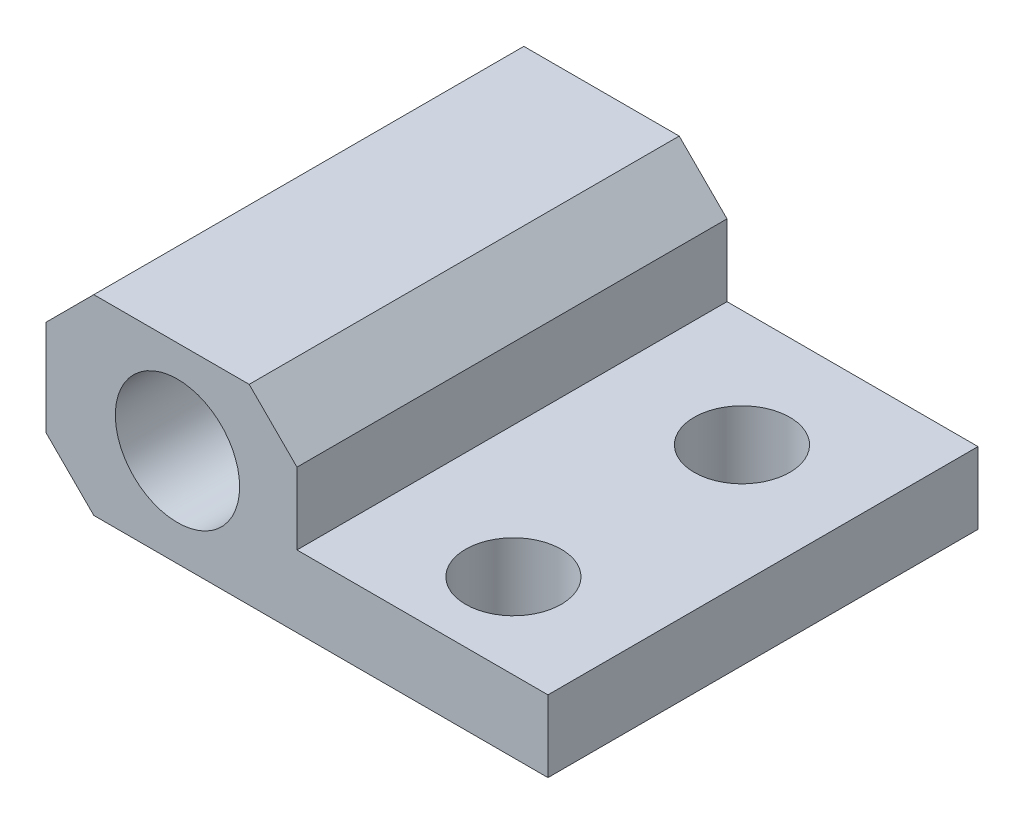
ISO-10303-21;
HEADER;
FILE_DESCRIPTION(('STEP AP214'),'2;1');
FILE_NAME('part.step','',(''),(''),'','','');
FILE_SCHEMA(('AUTOMOTIVE_DESIGN { 1 0 10303 214 1 1 1 1 }'));
ENDSEC;
DATA;
#1=APPLICATION_CONTEXT('core data for automotive mechanical design processes');
#2=APPLICATION_PROTOCOL_DEFINITION('international standard','automotive_design',2000,#1);
#3=PRODUCT_CONTEXT('',#1,'mechanical');
#4=PRODUCT('Part','Part','',(#3));
#5=PRODUCT_RELATED_PRODUCT_CATEGORY('part','',(#4));
#6=PRODUCT_DEFINITION_FORMATION('','',#4);
#7=PRODUCT_DEFINITION_CONTEXT('part definition',#1,'design');
#8=PRODUCT_DEFINITION('design','',#6,#7);
#9=PRODUCT_DEFINITION_SHAPE('','',#8);
#10=(LENGTH_UNIT() NAMED_UNIT(*) SI_UNIT(.MILLI.,.METRE.));
#11=(NAMED_UNIT(*) PLANE_ANGLE_UNIT() SI_UNIT($,.RADIAN.));
#12=(NAMED_UNIT(*) SI_UNIT($,.STERADIAN.) SOLID_ANGLE_UNIT());
#13=UNCERTAINTY_MEASURE_WITH_UNIT(LENGTH_MEASURE(1.E-05),#10,'distance_accuracy_value','');
#14=(GEOMETRIC_REPRESENTATION_CONTEXT(3) GLOBAL_UNCERTAINTY_ASSIGNED_CONTEXT((#13)) GLOBAL_UNIT_ASSIGNED_CONTEXT((#10,
#11,#12)) REPRESENTATION_CONTEXT('',''));
#15=CARTESIAN_POINT('',(0.,0.,0.));
#16=DIRECTION('',(0.,0.,1.));
#17=DIRECTION('',(1.,0.,0.));
#18=AXIS2_PLACEMENT_3D('',#15,#16,#17);
#19=CARTESIAN_POINT('',(-11.,8.,0.));
#20=DIRECTION('',(1.,0.,0.));
#21=DIRECTION('',(0.,0.,-1.));
#22=AXIS2_PLACEMENT_3D('',#19,#20,#21);
#23=PLANE('',#22);
#24=DIRECTION('',(0.,-1.,0.));
#25=VECTOR('',#24,1.);
#26=CARTESIAN_POINT('',(-11.,8.,0.));
#27=LINE('',#26,#25);
#28=CARTESIAN_POINT('',(-11.,5.99999999999999,0.));
#29=VERTEX_POINT('',#28);
#30=CARTESIAN_POINT('',(-11.,2.,0.));
#31=VERTEX_POINT('',#30);
#32=EDGE_CURVE('E142',#29,#31,#27,.T.);
#33=ORIENTED_EDGE('',*,*,#32,.T.);
#34=DIRECTION('',(0.,0.,1.));
#35=VECTOR('',#34,1.);
#36=CARTESIAN_POINT('',(-11.,2.,0.));
#37=LINE('',#36,#35);
#38=CARTESIAN_POINT('',(-11.,2.,17.9908558047486));
#39=VERTEX_POINT('',#38);
#40=EDGE_CURVE('E39',#31,#39,#37,.T.);
#41=ORIENTED_EDGE('',*,*,#40,.T.);
#42=DIRECTION('',(0.,-1.,0.));
#43=VECTOR('',#42,1.);
#44=CARTESIAN_POINT('',(-11.,8.,17.9908558047486));
#45=LINE('',#44,#43);
#46=CARTESIAN_POINT('',(-11.,5.99999999999999,17.9908558047486));
#47=VERTEX_POINT('',#46);
#48=EDGE_CURVE('E152',#47,#39,#45,.T.);
#49=ORIENTED_EDGE('',*,*,#48,.F.);
#50=DIRECTION('',(0.,0.,-1.));
#51=VECTOR('',#50,1.);
#52=CARTESIAN_POINT('',(-11.,5.99999999999999,0.));
#53=LINE('',#52,#51);
#54=EDGE_CURVE('E53',#47,#29,#53,.T.);
#55=ORIENTED_EDGE('',*,*,#54,.T.);
#56=EDGE_LOOP('',(#33,#41,#49,#55));
#57=FACE_BOUND('',#56,.T.);
#58=ADVANCED_FACE('F31',(#57),#23,.F.);
#59=CARTESIAN_POINT('',(-11.,8.,17.9908558047486));
#60=DIRECTION('',(0.,0.,-1.));
#61=DIRECTION('',(-1.,0.,0.));
#62=AXIS2_PLACEMENT_3D('',#59,#60,#61);
#63=PLANE('',#62);
#64=CARTESIAN_POINT('',(-5.50000003202421,4.09074319378488,17.9908558047486));
#65=DIRECTION('',(0.,0.,1.));
#66=DIRECTION('',(1.,0.,0.));
#67=AXIS2_PLACEMENT_3D('',#64,#65,#66);
#68=CIRCLE('',#67,2.6);
#69=CARTESIAN_POINT('',(-2.90000003202421,4.09074319378488,17.9908558047486));
#70=VERTEX_POINT('',#69);
#71=EDGE_CURVE('E243',#70,#70,#68,.T.);
#72=ORIENTED_EDGE('',*,*,#71,.F.);
#73=EDGE_LOOP('',(#72));
#74=FACE_BOUND('',#73,.T.);
#75=DIRECTION('',(0.,1.,0.));
#76=VECTOR('',#75,1.);
#77=CARTESIAN_POINT('',(-0.5,3.,17.9908558047486));
#78=LINE('',#77,#76);
#79=CARTESIAN_POINT('',(-0.5,3.,17.9908558047486));
#80=VERTEX_POINT('',#79);
#81=CARTESIAN_POINT('',(-0.499999999999999,6.,17.9908558047486));
#82=VERTEX_POINT('',#81);
#83=EDGE_CURVE('E117',#80,#82,#78,.T.);
#84=ORIENTED_EDGE('',*,*,#83,.T.);
#85=DIRECTION('',(-0.707106781186548,0.707106781186547,0.));
#86=VECTOR('',#85,1.);
#87=CARTESIAN_POINT('',(-0.5,6.,17.9908558047486));
#88=LINE('',#87,#86);
#89=CARTESIAN_POINT('',(-2.5,8.,17.9908558047486));
#90=VERTEX_POINT('',#89);
#91=EDGE_CURVE('E161',#82,#90,#88,.T.);
#92=ORIENTED_EDGE('',*,*,#91,.T.);
#93=DIRECTION('',(1.,0.,0.));
#94=VECTOR('',#93,1.);
#95=CARTESIAN_POINT('',(-11.,8.,17.9908558047486));
#96=LINE('',#95,#94);
#97=CARTESIAN_POINT('',(-8.99999999999999,8.,17.9908558047486));
#98=VERTEX_POINT('',#97);
#99=EDGE_CURVE('E135',#98,#90,#96,.T.);
#100=ORIENTED_EDGE('',*,*,#99,.F.);
#101=DIRECTION('',(-0.707106781186547,-0.707106781186548,0.));
#102=VECTOR('',#101,1.);
#103=CARTESIAN_POINT('',(-8.99999999999999,8.,17.9908558047486));
#104=LINE('',#103,#102);
#105=EDGE_CURVE('E157',#98,#47,#104,.T.);
#106=ORIENTED_EDGE('',*,*,#105,.T.);
#107=ORIENTED_EDGE('',*,*,#48,.T.);
#108=DIRECTION('',(-0.707106781186549,0.707106781186546,0.));
#109=VECTOR('',#108,1.);
#110=CARTESIAN_POINT('',(-11.,2.,17.9908558047486));
#111=LINE('',#110,#109);
#112=CARTESIAN_POINT('',(-8.99999999999999,0.,17.9908558047486));
#113=VERTEX_POINT('',#112);
#114=EDGE_CURVE('E159',#39,#113,#111,.F.);
#115=ORIENTED_EDGE('',*,*,#114,.T.);
#116=DIRECTION('',(1.,0.,0.));
#117=VECTOR('',#116,1.);
#118=CARTESIAN_POINT('',(-11.,0.,17.9908558047486));
#119=LINE('',#118,#117);
#120=CARTESIAN_POINT('',(10.,0.,17.9908558047486));
#121=VERTEX_POINT('',#120);
#122=EDGE_CURVE('E134',#113,#121,#119,.T.);
#123=ORIENTED_EDGE('',*,*,#122,.T.);
#124=DIRECTION('',(0.,-1.,0.));
#125=VECTOR('',#124,1.);
#126=CARTESIAN_POINT('',(10.,8.,17.9908558047486));
#127=LINE('',#126,#125);
#128=CARTESIAN_POINT('',(9.99999999481246,3.,17.9908558047486));
#129=VERTEX_POINT('',#128);
#130=EDGE_CURVE('E128',#129,#121,#127,.T.);
#131=ORIENTED_EDGE('',*,*,#130,.F.);
#132=DIRECTION('',(1.,0.,0.));
#133=VECTOR('',#132,1.);
#134=CARTESIAN_POINT('',(-0.5,3.,17.9908558047486));
#135=LINE('',#134,#133);
#136=EDGE_CURVE('E107',#80,#129,#135,.T.);
#137=ORIENTED_EDGE('',*,*,#136,.F.);
#138=EDGE_LOOP('',(#84,#92,#100,#106,#107,#115,#123,#131,#137));
#139=FACE_BOUND('',#138,.T.);
#140=ADVANCED_FACE('F126',(#74,#139),#63,.F.);
#141=CARTESIAN_POINT('',(10.,8.,0.));
#142=DIRECTION('',(-1.,0.,0.));
#143=DIRECTION('',(0.,0.,1.));
#144=AXIS2_PLACEMENT_3D('',#141,#142,#143);
#145=PLANE('',#144);
#146=DIRECTION('',(0.,-1.,0.));
#147=VECTOR('',#146,1.);
#148=CARTESIAN_POINT('',(10.,8.,0.));
#149=LINE('',#148,#147);
#150=CARTESIAN_POINT('',(9.99999999481246,3.,0.));
#151=VERTEX_POINT('',#150);
#152=CARTESIAN_POINT('',(10.,0.,0.));
#153=VERTEX_POINT('',#152);
#154=EDGE_CURVE('E149',#151,#153,#149,.T.);
#155=ORIENTED_EDGE('',*,*,#154,.F.);
#156=DIRECTION('',(0.,0.,-1.));
#157=VECTOR('',#156,1.);
#158=CARTESIAN_POINT('',(9.99999999481246,3.,17.9908558047486));
#159=LINE('',#158,#157);
#160=EDGE_CURVE('E123',#129,#151,#159,.T.);
#161=ORIENTED_EDGE('',*,*,#160,.F.);
#162=ORIENTED_EDGE('',*,*,#130,.T.);
#163=DIRECTION('',(0.,0.,-1.));
#164=VECTOR('',#163,1.);
#165=CARTESIAN_POINT('',(10.,0.,0.));
#166=LINE('',#165,#164);
#167=EDGE_CURVE('E144',#121,#153,#166,.T.);
#168=ORIENTED_EDGE('',*,*,#167,.T.);
#169=EDGE_LOOP('',(#155,#161,#162,#168));
#170=FACE_BOUND('',#169,.T.);
#171=ADVANCED_FACE('F205',(#170),#145,.F.);
#172=CARTESIAN_POINT('',(-11.,8.,0.));
#173=DIRECTION('',(0.,0.,1.));
#174=DIRECTION('',(1.,0.,0.));
#175=AXIS2_PLACEMENT_3D('',#172,#173,#174);
#176=PLANE('',#175);
#177=DIRECTION('',(-1.,0.,0.));
#178=VECTOR('',#177,1.);
#179=CARTESIAN_POINT('',(-11.,8.,0.));
#180=LINE('',#179,#178);
#181=CARTESIAN_POINT('',(-2.5,8.,0.));
#182=VERTEX_POINT('',#181);
#183=CARTESIAN_POINT('',(-8.99999999999999,8.,0.));
#184=VERTEX_POINT('',#183);
#185=EDGE_CURVE('E138',#182,#184,#180,.T.);
#186=ORIENTED_EDGE('',*,*,#185,.F.);
#187=DIRECTION('',(0.707106781186548,-0.707106781186547,0.));
#188=VECTOR('',#187,1.);
#189=CARTESIAN_POINT('',(-0.5,6.,0.));
#190=LINE('',#189,#188);
#191=CARTESIAN_POINT('',(-0.499999999999999,6.,0.));
#192=VERTEX_POINT('',#191);
#193=EDGE_CURVE('E171',#182,#192,#190,.T.);
#194=ORIENTED_EDGE('',*,*,#193,.T.);
#195=DIRECTION('',(0.,-1.,0.));
#196=VECTOR('',#195,1.);
#197=CARTESIAN_POINT('',(-0.499999999999999,8.,0.));
#198=LINE('',#197,#196);
#199=CARTESIAN_POINT('',(-0.5,3.,0.));
#200=VERTEX_POINT('',#199);
#201=EDGE_CURVE('E122',#192,#200,#198,.T.);
#202=ORIENTED_EDGE('',*,*,#201,.T.);
#203=DIRECTION('',(1.,0.,0.));
#204=VECTOR('',#203,1.);
#205=CARTESIAN_POINT('',(-11.,3.,0.));
#206=LINE('',#205,#204);
#207=EDGE_CURVE('E110',#200,#151,#206,.T.);
#208=ORIENTED_EDGE('',*,*,#207,.T.);
#209=ORIENTED_EDGE('',*,*,#154,.T.);
#210=DIRECTION('',(-1.,0.,0.));
#211=VECTOR('',#210,1.);
#212=CARTESIAN_POINT('',(-11.,0.,0.));
#213=LINE('',#212,#211);
#214=CARTESIAN_POINT('',(-8.99999999999999,0.,0.));
#215=VERTEX_POINT('',#214);
#216=EDGE_CURVE('E139',#153,#215,#213,.T.);
#217=ORIENTED_EDGE('',*,*,#216,.T.);
#218=DIRECTION('',(0.707106781186549,-0.707106781186546,0.));
#219=VECTOR('',#218,1.);
#220=CARTESIAN_POINT('',(-11.,2.,0.));
#221=LINE('',#220,#219);
#222=EDGE_CURVE('E46',#215,#31,#221,.F.);
#223=ORIENTED_EDGE('',*,*,#222,.T.);
#224=ORIENTED_EDGE('',*,*,#32,.F.);
#225=DIRECTION('',(0.707106781186547,0.707106781186548,0.));
#226=VECTOR('',#225,1.);
#227=CARTESIAN_POINT('',(-8.99999999999999,8.,0.));
#228=LINE('',#227,#226);
#229=EDGE_CURVE('E168',#29,#184,#228,.T.);
#230=ORIENTED_EDGE('',*,*,#229,.T.);
#231=EDGE_LOOP('',(#186,#194,#202,#208,#209,#217,#223,#224,#230));
#232=FACE_BOUND('',#231,.T.);
#233=ADVANCED_FACE('F186',(#232),#176,.F.);
#234=CARTESIAN_POINT('',(-11.,8.,17.9908558047486));
#235=DIRECTION('',(0.,1.,0.));
#236=DIRECTION('',(0.,0.,1.));
#237=AXIS2_PLACEMENT_3D('',#234,#235,#236);
#238=PLANE('',#237);
#239=ORIENTED_EDGE('',*,*,#99,.T.);
#240=DIRECTION('',(0.,0.,-1.));
#241=VECTOR('',#240,1.);
#242=CARTESIAN_POINT('',(-2.5,8.,0.));
#243=LINE('',#242,#241);
#244=EDGE_CURVE('E166',#90,#182,#243,.T.);
#245=ORIENTED_EDGE('',*,*,#244,.T.);
#246=ORIENTED_EDGE('',*,*,#185,.T.);
#247=DIRECTION('',(0.,0.,1.));
#248=VECTOR('',#247,1.);
#249=CARTESIAN_POINT('',(-8.99999999999999,8.,17.9908558047486));
#250=LINE('',#249,#248);
#251=EDGE_CURVE('E163',#184,#98,#250,.T.);
#252=ORIENTED_EDGE('',*,*,#251,.T.);
#253=EDGE_LOOP('',(#239,#245,#246,#252));
#254=FACE_BOUND('',#253,.T.);
#255=ADVANCED_FACE('F182',(#254),#238,.T.);
#256=CARTESIAN_POINT('',(-11.,0.,17.9908558047486));
#257=DIRECTION('',(0.,1.,0.));
#258=DIRECTION('',(0.,0.,1.));
#259=AXIS2_PLACEMENT_3D('',#256,#257,#258);
#260=PLANE('',#259);
#261=CARTESIAN_POINT('',(4.99999999481206,0.,4.87358379755558));
#262=DIRECTION('',(0.,1.,0.));
#263=DIRECTION('',(0.,0.,1.));
#264=AXIS2_PLACEMENT_3D('',#261,#262,#263);
#265=CIRCLE('',#264,1.99999994245589);
#266=CARTESIAN_POINT('',(4.99999999481206,0.,6.87358374001147));
#267=VERTEX_POINT('',#266);
#268=EDGE_CURVE('E248',#267,#267,#265,.T.);
#269=ORIENTED_EDGE('',*,*,#268,.T.);
#270=EDGE_LOOP('',(#269));
#271=FACE_BOUND('',#270,.T.);
#272=CARTESIAN_POINT('',(4.99999999481206,0.,14.4361185859939));
#273=DIRECTION('',(0.,1.,0.));
#274=DIRECTION('',(0.,0.,1.));
#275=AXIS2_PLACEMENT_3D('',#272,#273,#274);
#276=CIRCLE('',#275,1.99999988156109);
#277=CARTESIAN_POINT('',(4.99999999481206,0.,16.4361184675549));
#278=VERTEX_POINT('',#277);
#279=EDGE_CURVE('E113',#278,#278,#276,.T.);
#280=ORIENTED_EDGE('',*,*,#279,.T.);
#281=EDGE_LOOP('',(#280));
#282=FACE_BOUND('',#281,.T.);
#283=ORIENTED_EDGE('',*,*,#122,.F.);
#284=DIRECTION('',(0.,0.,-1.));
#285=VECTOR('',#284,1.);
#286=CARTESIAN_POINT('',(-8.99999999999999,0.,17.9908558047486));
#287=LINE('',#286,#285);
#288=EDGE_CURVE('E11',#113,#215,#287,.T.);
#289=ORIENTED_EDGE('',*,*,#288,.T.);
#290=ORIENTED_EDGE('',*,*,#216,.F.);
#291=ORIENTED_EDGE('',*,*,#167,.F.);
#292=EDGE_LOOP('',(#283,#289,#290,#291));
#293=FACE_BOUND('',#292,.T.);
#294=ADVANCED_FACE('F214',(#271,#282,#293),#260,.F.);
#295=CARTESIAN_POINT('',(-0.5,3.,-0.00351336228412991));
#296=DIRECTION('',(0.,-1.,0.));
#297=DIRECTION('',(0.,0.,-1.));
#298=AXIS2_PLACEMENT_3D('',#295,#296,#297);
#299=PLANE('',#298);
#300=CARTESIAN_POINT('',(4.99999999481206,3.,4.87358379755558));
#301=DIRECTION('',(0.,1.,0.));
#302=DIRECTION('',(0.,0.,1.));
#303=AXIS2_PLACEMENT_3D('',#300,#301,#302);
#304=CIRCLE('',#303,1.99999994245589);
#305=CARTESIAN_POINT('',(4.99999999481206,3.,6.87358374001147));
#306=VERTEX_POINT('',#305);
#307=EDGE_CURVE('E245',#306,#306,#304,.T.);
#308=ORIENTED_EDGE('',*,*,#307,.F.);
#309=EDGE_LOOP('',(#308));
#310=FACE_BOUND('',#309,.T.);
#311=CARTESIAN_POINT('',(4.99999999481206,3.,14.4361185859939));
#312=DIRECTION('',(0.,1.,0.));
#313=DIRECTION('',(0.,0.,1.));
#314=AXIS2_PLACEMENT_3D('',#311,#312,#313);
#315=CIRCLE('',#314,1.99999988156109);
#316=CARTESIAN_POINT('',(4.99999999481206,3.,16.4361184675549));
#317=VERTEX_POINT('',#316);
#318=EDGE_CURVE('E251',#317,#317,#315,.T.);
#319=ORIENTED_EDGE('',*,*,#318,.F.);
#320=EDGE_LOOP('',(#319));
#321=FACE_BOUND('',#320,.T.);
#322=DIRECTION('',(0.,0.,1.));
#323=VECTOR('',#322,1.);
#324=CARTESIAN_POINT('',(-0.5,3.,17.9908558047486));
#325=LINE('',#324,#323);
#326=EDGE_CURVE('E103',#200,#80,#325,.T.);
#327=ORIENTED_EDGE('',*,*,#326,.T.);
#328=ORIENTED_EDGE('',*,*,#136,.T.);
#329=ORIENTED_EDGE('',*,*,#160,.T.);
#330=ORIENTED_EDGE('',*,*,#207,.F.);
#331=EDGE_LOOP('',(#327,#328,#329,#330));
#332=FACE_BOUND('',#331,.T.);
#333=ADVANCED_FACE('F105',(#310,#321,#332),#299,.F.);
#334=CARTESIAN_POINT('',(-0.5,3.,17.9908558047486));
#335=DIRECTION('',(-1.,0.,0.));
#336=DIRECTION('',(0.,0.,1.));
#337=AXIS2_PLACEMENT_3D('',#334,#335,#336);
#338=PLANE('',#337);
#339=ORIENTED_EDGE('',*,*,#201,.F.);
#340=DIRECTION('',(0.,0.,1.));
#341=VECTOR('',#340,1.);
#342=CARTESIAN_POINT('',(-0.5,6.,17.9908558047486));
#343=LINE('',#342,#341);
#344=EDGE_CURVE('E120',#192,#82,#343,.T.);
#345=ORIENTED_EDGE('',*,*,#344,.T.);
#346=ORIENTED_EDGE('',*,*,#83,.F.);
#347=ORIENTED_EDGE('',*,*,#326,.F.);
#348=EDGE_LOOP('',(#339,#345,#346,#347));
#349=FACE_BOUND('',#348,.T.);
#350=ADVANCED_FACE('F118',(#349),#338,.F.);
#351=CARTESIAN_POINT('',(4.99999999481206,0.,14.4361185859939));
#352=DIRECTION('',(0.,1.,0.));
#353=DIRECTION('',(0.,0.,1.));
#354=AXIS2_PLACEMENT_3D('',#351,#352,#353);
#355=CYLINDRICAL_SURFACE('',#354,1.99999988156109);
#356=ORIENTED_EDGE('',*,*,#279,.F.);
#357=EDGE_LOOP('',(#356));
#358=FACE_BOUND('',#357,.T.);
#359=ORIENTED_EDGE('',*,*,#318,.T.);
#360=EDGE_LOOP('',(#359));
#361=FACE_BOUND('',#360,.T.);
#362=ADVANCED_FACE('F222',(#358,#361),#355,.F.);
#363=CARTESIAN_POINT('',(4.99999999481206,0.,4.87358379755558));
#364=DIRECTION('',(0.,1.,0.));
#365=DIRECTION('',(0.,0.,1.));
#366=AXIS2_PLACEMENT_3D('',#363,#364,#365);
#367=CYLINDRICAL_SURFACE('',#366,1.99999994245589);
#368=ORIENTED_EDGE('',*,*,#268,.F.);
#369=EDGE_LOOP('',(#368));
#370=FACE_BOUND('',#369,.T.);
#371=ORIENTED_EDGE('',*,*,#307,.T.);
#372=EDGE_LOOP('',(#371));
#373=FACE_BOUND('',#372,.T.);
#374=ADVANCED_FACE('F228',(#370,#373),#367,.F.);
#375=CARTESIAN_POINT('',(-5.50000003202421,4.09074319378488,2.99085580474864));
#376=DIRECTION('',(0.,0.,1.));
#377=DIRECTION('',(1.,0.,0.));
#378=AXIS2_PLACEMENT_3D('',#375,#376,#377);
#379=CYLINDRICAL_SURFACE('',#378,2.6);
#380=CARTESIAN_POINT('',(-5.50000003202421,4.09074319378488,2.99085580474864));
#381=DIRECTION('',(0.,0.,1.));
#382=DIRECTION('',(1.,0.,0.));
#383=AXIS2_PLACEMENT_3D('',#380,#381,#382);
#384=CIRCLE('',#383,2.6);
#385=CARTESIAN_POINT('',(-2.90000003202421,4.09074319378488,2.99085580474864));
#386=VERTEX_POINT('',#385);
#387=EDGE_CURVE('E240',#386,#386,#384,.T.);
#388=ORIENTED_EDGE('',*,*,#387,.F.);
#389=EDGE_LOOP('',(#388));
#390=FACE_BOUND('',#389,.T.);
#391=ORIENTED_EDGE('',*,*,#71,.T.);
#392=EDGE_LOOP('',(#391));
#393=FACE_BOUND('',#392,.T.);
#394=ADVANCED_FACE('F197',(#390,#393),#379,.F.);
#395=CARTESIAN_POINT('',(-5.50000003202421,4.09074319378488,2.99085580474864));
#396=DIRECTION('',(0.,0.,1.));
#397=DIRECTION('',(1.,0.,0.));
#398=AXIS2_PLACEMENT_3D('',#395,#396,#397);
#399=PLANE('',#398);
#400=ORIENTED_EDGE('',*,*,#387,.T.);
#401=EDGE_LOOP('',(#400));
#402=FACE_BOUND('',#401,.T.);
#403=ADVANCED_FACE('F191',(#402),#399,.T.);
#404=CARTESIAN_POINT('',(-0.5,6.,17.9908558047486));
#405=DIRECTION('',(0.707106781186547,0.707106781186548,0.));
#406=DIRECTION('',(-0.707106781186548,0.707106781186547,0.));
#407=AXIS2_PLACEMENT_3D('',#404,#405,#406);
#408=PLANE('',#407);
#409=ORIENTED_EDGE('',*,*,#193,.F.);
#410=ORIENTED_EDGE('',*,*,#244,.F.);
#411=ORIENTED_EDGE('',*,*,#91,.F.);
#412=ORIENTED_EDGE('',*,*,#344,.F.);
#413=EDGE_LOOP('',(#409,#410,#411,#412));
#414=FACE_BOUND('',#413,.T.);
#415=ADVANCED_FACE('F188',(#414),#408,.T.);
#416=CARTESIAN_POINT('',(-11.,2.,0.));
#417=DIRECTION('',(0.707106781186546,0.707106781186549,0.));
#418=DIRECTION('',(-0.707106781186549,0.707106781186546,0.));
#419=AXIS2_PLACEMENT_3D('',#416,#417,#418);
#420=PLANE('',#419);
#421=ORIENTED_EDGE('',*,*,#222,.F.);
#422=ORIENTED_EDGE('',*,*,#288,.F.);
#423=ORIENTED_EDGE('',*,*,#114,.F.);
#424=ORIENTED_EDGE('',*,*,#40,.F.);
#425=EDGE_LOOP('',(#421,#422,#423,#424));
#426=FACE_BOUND('',#425,.T.);
#427=ADVANCED_FACE('F190',(#426),#420,.F.);
#428=CARTESIAN_POINT('',(-8.99999999999999,8.,17.9908558047486));
#429=DIRECTION('',(-0.707106781186548,0.707106781186547,0.));
#430=DIRECTION('',(-0.707106781186547,-0.707106781186548,0.));
#431=AXIS2_PLACEMENT_3D('',#428,#429,#430);
#432=PLANE('',#431);
#433=ORIENTED_EDGE('',*,*,#229,.F.);
#434=ORIENTED_EDGE('',*,*,#54,.F.);
#435=ORIENTED_EDGE('',*,*,#105,.F.);
#436=ORIENTED_EDGE('',*,*,#251,.F.);
#437=EDGE_LOOP('',(#433,#434,#435,#436));
#438=FACE_BOUND('',#437,.T.);
#439=ADVANCED_FACE('F33',(#438),#432,.T.);
#440=CLOSED_SHELL('',(#58,#140,#171,#233,#255,#294,#333,#350,#362,#374,#394,#403,#415,#427,#439));
#441=MANIFOLD_SOLID_BREP('B2',#440);
#442=ADVANCED_BREP_SHAPE_REPRESENTATION('',(#18,#441),#14);
#443=SHAPE_DEFINITION_REPRESENTATION(#9,#442);
ENDSEC;
END-ISO-10303-21;
